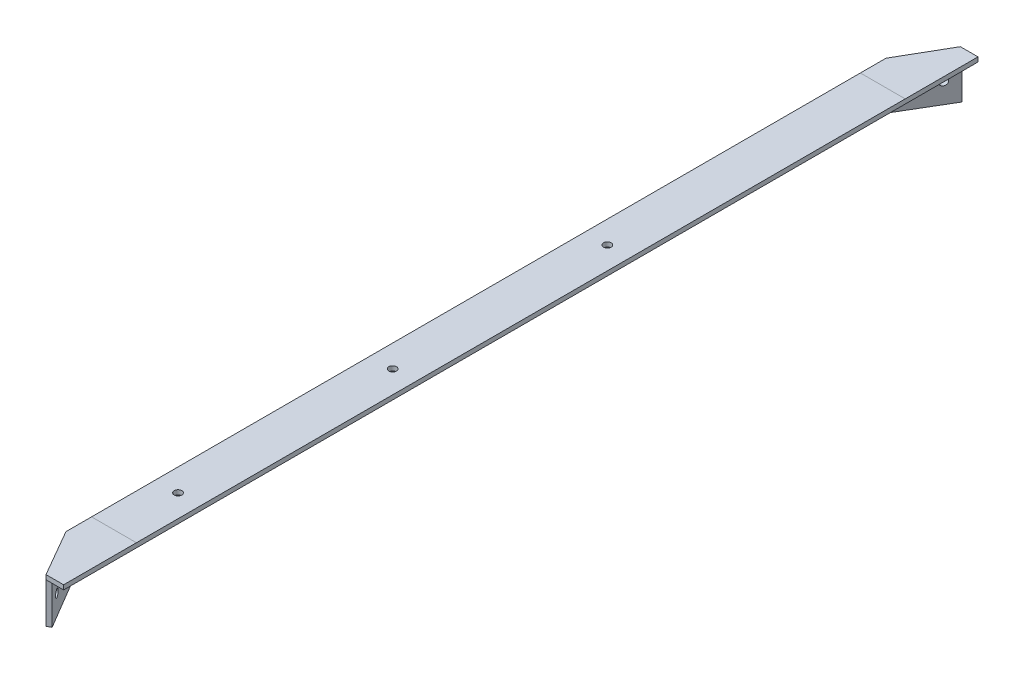
ISO-10303-21;
HEADER;
FILE_DESCRIPTION(('STEP AP214'),'2;1');
FILE_NAME('part.step','',(''),(''),'','','');
FILE_SCHEMA(('AUTOMOTIVE_DESIGN { 1 0 10303 214 1 1 1 1 }'));
ENDSEC;
DATA;
#1=APPLICATION_CONTEXT('core data for automotive mechanical design processes');
#2=APPLICATION_PROTOCOL_DEFINITION('international standard','automotive_design',2000,#1);
#3=PRODUCT_CONTEXT('',#1,'mechanical');
#4=PRODUCT('Part','Part','',(#3));
#5=PRODUCT_RELATED_PRODUCT_CATEGORY('part','',(#4));
#6=PRODUCT_DEFINITION_FORMATION('','',#4);
#7=PRODUCT_DEFINITION_CONTEXT('part definition',#1,'design');
#8=PRODUCT_DEFINITION('design','',#6,#7);
#9=PRODUCT_DEFINITION_SHAPE('','',#8);
#10=(LENGTH_UNIT() NAMED_UNIT(*) SI_UNIT(.MILLI.,.METRE.));
#11=(NAMED_UNIT(*) PLANE_ANGLE_UNIT() SI_UNIT($,.RADIAN.));
#12=(NAMED_UNIT(*) SI_UNIT($,.STERADIAN.) SOLID_ANGLE_UNIT());
#13=UNCERTAINTY_MEASURE_WITH_UNIT(LENGTH_MEASURE(1.E-05),#10,'distance_accuracy_value','');
#14=(GEOMETRIC_REPRESENTATION_CONTEXT(3) GLOBAL_UNCERTAINTY_ASSIGNED_CONTEXT((#13)) GLOBAL_UNIT_ASSIGNED_CONTEXT((#10,
#11,#12)) REPRESENTATION_CONTEXT('',''));
#15=CARTESIAN_POINT('',(0.,0.,0.));
#16=DIRECTION('',(0.,0.,1.));
#17=DIRECTION('',(1.,0.,0.));
#18=AXIS2_PLACEMENT_3D('',#15,#16,#17);
#19=CARTESIAN_POINT('',(0.,70.,640.));
#20=DIRECTION('',(0.,-1.,0.));
#21=DIRECTION('',(0.,0.,-1.));
#22=AXIS2_PLACEMENT_3D('',#19,#20,#21);
#23=PLANE('',#22);
#24=DIRECTION('',(1.,0.,0.));
#25=VECTOR('',#24,1.);
#26=CARTESIAN_POINT('',(0.,70.,600.002159321677));
#27=LINE('',#26,#25);
#28=CARTESIAN_POINT('',(0.,70.,600.002159321677));
#29=VERTEX_POINT('',#28);
#30=CARTESIAN_POINT('',(70.,70.,600.002159321677));
#31=VERTEX_POINT('',#30);
#32=EDGE_CURVE('E11',#29,#31,#27,.T.);
#33=ORIENTED_EDGE('',*,*,#32,.F.);
#34=DIRECTION('',(0.,0.,-1.));
#35=VECTOR('',#34,1.);
#36=CARTESIAN_POINT('',(0.,70.,640.));
#37=LINE('',#36,#35);
#38=CARTESIAN_POINT('',(0.,70.,640.));
#39=VERTEX_POINT('',#38);
#40=EDGE_CURVE('E282',#39,#29,#37,.T.);
#41=ORIENTED_EDGE('',*,*,#40,.F.);
#42=DIRECTION('',(0.5,0.,0.866025403784439));
#43=VECTOR('',#42,1.);
#44=CARTESIAN_POINT('',(0.,70.,640.));
#45=LINE('',#44,#43);
#46=CARTESIAN_POINT('',(42.5,70.,713.612159321677));
#47=VERTEX_POINT('',#46);
#48=EDGE_CURVE('E227',#39,#47,#45,.T.);
#49=ORIENTED_EDGE('',*,*,#48,.T.);
#50=DIRECTION('',(1.,0.,0.));
#51=VECTOR('',#50,1.);
#52=CARTESIAN_POINT('',(42.5,70.,713.612159321677));
#53=LINE('',#52,#51);
#54=CARTESIAN_POINT('',(70.,70.,713.612159321677));
#55=VERTEX_POINT('',#54);
#56=EDGE_CURVE('E230',#47,#55,#53,.T.);
#57=ORIENTED_EDGE('',*,*,#56,.T.);
#58=DIRECTION('',(0.,0.,-1.));
#59=VECTOR('',#58,1.);
#60=CARTESIAN_POINT('',(70.,70.,640.));
#61=LINE('',#60,#59);
#62=EDGE_CURVE('E287',#55,#31,#61,.T.);
#63=ORIENTED_EDGE('',*,*,#62,.T.);
#64=EDGE_LOOP('',(#33,#41,#49,#57,#63));
#65=FACE_BOUND('',#64,.T.);
#66=ADVANCED_FACE('F48',(#65),#23,.F.);
#67=DIRECTION('',(-1.,0.,0.));
#68=VECTOR('',#67,1.);
#69=CARTESIAN_POINT('',(0.,70.,-600.002159321677));
#70=LINE('',#69,#68);
#71=CARTESIAN_POINT('',(70.,70.,-600.002159321677));
#72=VERTEX_POINT('',#71);
#73=CARTESIAN_POINT('',(0.,70.,-600.002159321677));
#74=VERTEX_POINT('',#73);
#75=EDGE_CURVE('E57',#72,#74,#70,.T.);
#76=ORIENTED_EDGE('',*,*,#75,.F.);
#77=CARTESIAN_POINT('',(70.,70.,-713.612159321677));
#78=VERTEX_POINT('',#77);
#79=EDGE_CURVE('E169',#72,#78,#61,.T.);
#80=ORIENTED_EDGE('',*,*,#79,.T.);
#81=DIRECTION('',(1.,0.,0.));
#82=VECTOR('',#81,1.);
#83=CARTESIAN_POINT('',(42.5,70.,-713.612159321677));
#84=LINE('',#83,#82);
#85=CARTESIAN_POINT('',(42.5,70.,-713.612159321677));
#86=VERTEX_POINT('',#85);
#87=EDGE_CURVE('E147',#86,#78,#84,.T.);
#88=ORIENTED_EDGE('',*,*,#87,.F.);
#89=DIRECTION('',(0.5,0.,-0.866025403784439));
#90=VECTOR('',#89,1.);
#91=CARTESIAN_POINT('',(0.,70.,-640.));
#92=LINE('',#91,#90);
#93=CARTESIAN_POINT('',(0.,70.,-640.));
#94=VERTEX_POINT('',#93);
#95=EDGE_CURVE('E159',#94,#86,#92,.T.);
#96=ORIENTED_EDGE('',*,*,#95,.F.);
#97=EDGE_CURVE('E281',#74,#94,#37,.T.);
#98=ORIENTED_EDGE('',*,*,#97,.F.);
#99=EDGE_LOOP('',(#76,#80,#88,#96,#98));
#100=FACE_BOUND('',#99,.T.);
#101=ADVANCED_FACE('F167',(#100),#23,.F.);
#102=CARTESIAN_POINT('',(7.,0.,640.));
#103=DIRECTION('',(0.,1.,0.));
#104=DIRECTION('',(-1.,0.,0.));
#105=AXIS2_PLACEMENT_3D('',#102,#103,#104);
#106=PLANE('',#105);
#107=DIRECTION('',(0.,0.,-1.));
#108=VECTOR('',#107,1.);
#109=CARTESIAN_POINT('',(0.,0.,640.));
#110=LINE('',#109,#108);
#111=CARTESIAN_POINT('',(0.,0.,640.));
#112=VERTEX_POINT('',#111);
#113=CARTESIAN_POINT('',(0.,0.,-640.));
#114=VERTEX_POINT('',#113);
#115=EDGE_CURVE('E278',#112,#114,#110,.T.);
#116=ORIENTED_EDGE('',*,*,#115,.T.);
#117=DIRECTION('',(0.5,0.,-0.866025403784439));
#118=VECTOR('',#117,1.);
#119=CARTESIAN_POINT('',(0.,0.,-640.));
#120=LINE('',#119,#118);
#121=CARTESIAN_POINT('',(42.5,0.,-713.612159321677));
#122=VERTEX_POINT('',#121);
#123=EDGE_CURVE('E154',#114,#122,#120,.T.);
#124=ORIENTED_EDGE('',*,*,#123,.T.);
#125=DIRECTION('',(0.866025403784443,0.,0.499999999999992));
#126=VECTOR('',#125,1.);
#127=CARTESIAN_POINT('',(42.5,0.,-713.612159321677));
#128=LINE('',#127,#126);
#129=CARTESIAN_POINT('',(48.5621778264911,0.,-710.112159321677));
#130=VERTEX_POINT('',#129);
#131=EDGE_CURVE('E192',#122,#130,#128,.T.);
#132=ORIENTED_EDGE('',*,*,#131,.T.);
#133=DIRECTION('',(-0.509931612811304,0.,0.860214944217817));
#134=VECTOR('',#133,1.);
#135=CARTESIAN_POINT('',(48.5621778264911,0.,-710.112159321677));
#136=LINE('',#135,#134);
#137=CARTESIAN_POINT('',(7.,0.,-640.));
#138=VERTEX_POINT('',#137);
#139=EDGE_CURVE('E184',#130,#138,#136,.T.);
#140=ORIENTED_EDGE('',*,*,#139,.T.);
#141=DIRECTION('',(0.,0.,-1.));
#142=VECTOR('',#141,1.);
#143=CARTESIAN_POINT('',(7.,0.,640.));
#144=LINE('',#143,#142);
#145=CARTESIAN_POINT('',(7.,0.,640.));
#146=VERTEX_POINT('',#145);
#147=EDGE_CURVE('E297',#146,#138,#144,.T.);
#148=ORIENTED_EDGE('',*,*,#147,.F.);
#149=DIRECTION('',(-0.509931612811304,0.,-0.860214944217817));
#150=VECTOR('',#149,1.);
#151=CARTESIAN_POINT('',(48.5621778264911,0.,710.112159321677));
#152=LINE('',#151,#150);
#153=CARTESIAN_POINT('',(48.5621778264911,0.,710.112159321677));
#154=VERTEX_POINT('',#153);
#155=EDGE_CURVE('E251',#154,#146,#152,.T.);
#156=ORIENTED_EDGE('',*,*,#155,.F.);
#157=DIRECTION('',(0.866025403784443,0.,-0.499999999999992));
#158=VECTOR('',#157,1.);
#159=CARTESIAN_POINT('',(42.5,0.,713.612159321677));
#160=LINE('',#159,#158);
#161=CARTESIAN_POINT('',(42.5,0.,713.612159321677));
#162=VERTEX_POINT('',#161);
#163=EDGE_CURVE('E258',#162,#154,#160,.T.);
#164=ORIENTED_EDGE('',*,*,#163,.F.);
#165=DIRECTION('',(0.5,0.,0.866025403784439));
#166=VECTOR('',#165,1.);
#167=CARTESIAN_POINT('',(0.,0.,640.));
#168=LINE('',#167,#166);
#169=EDGE_CURVE('E245',#112,#162,#168,.T.);
#170=ORIENTED_EDGE('',*,*,#169,.F.);
#171=EDGE_LOOP('',(#116,#124,#132,#140,#148,#156,#164,#170));
#172=FACE_BOUND('',#171,.T.);
#173=ADVANCED_FACE('F50',(#172),#106,.F.);
#174=CARTESIAN_POINT('',(6.99999999999999,63.,640.));
#175=DIRECTION('',(-1.,0.,0.));
#176=DIRECTION('',(0.,-1.,0.));
#177=AXIS2_PLACEMENT_3D('',#174,#175,#176);
#178=PLANE('',#177);
#179=ORIENTED_EDGE('',*,*,#147,.T.);
#180=DIRECTION('',(0.,1.,0.));
#181=VECTOR('',#180,1.);
#182=CARTESIAN_POINT('',(6.99999999999999,63.,-640.));
#183=LINE('',#182,#181);
#184=CARTESIAN_POINT('',(6.99999999999999,63.,-640.));
#185=VERTEX_POINT('',#184);
#186=EDGE_CURVE('E204',#138,#185,#183,.T.);
#187=ORIENTED_EDGE('',*,*,#186,.T.);
#188=DIRECTION('',(0.,0.,-1.));
#189=VECTOR('',#188,1.);
#190=CARTESIAN_POINT('',(6.99999999999999,63.,640.));
#191=LINE('',#190,#189);
#192=CARTESIAN_POINT('',(6.99999999999999,63.,640.));
#193=VERTEX_POINT('',#192);
#194=EDGE_CURVE('E294',#193,#185,#191,.T.);
#195=ORIENTED_EDGE('',*,*,#194,.F.);
#196=DIRECTION('',(0.,1.,0.));
#197=VECTOR('',#196,1.);
#198=CARTESIAN_POINT('',(6.99999999999999,63.,640.));
#199=LINE('',#198,#197);
#200=EDGE_CURVE('E271',#146,#193,#199,.T.);
#201=ORIENTED_EDGE('',*,*,#200,.F.);
#202=EDGE_LOOP('',(#179,#187,#195,#201));
#203=FACE_BOUND('',#202,.T.);
#204=ADVANCED_FACE('F360',(#203),#178,.F.);
#205=CARTESIAN_POINT('',(70.,63.,640.));
#206=DIRECTION('',(0.,1.,0.));
#207=DIRECTION('',(-1.,0.,0.));
#208=AXIS2_PLACEMENT_3D('',#205,#206,#207);
#209=PLANE('',#208);
#210=CARTESIAN_POINT('',(35.,63.,500.));
#211=DIRECTION('',(0.,1.,0.));
#212=DIRECTION('',(-1.,0.,0.));
#213=AXIS2_PLACEMENT_3D('',#210,#211,#212);
#214=CIRCLE('',#213,6.);
#215=CARTESIAN_POINT('',(29.,63.,500.));
#216=VERTEX_POINT('',#215);
#217=EDGE_CURVE('E313',#216,#216,#214,.F.);
#218=ORIENTED_EDGE('',*,*,#217,.F.);
#219=EDGE_LOOP('',(#218));
#220=FACE_BOUND('',#219,.T.);
#221=CARTESIAN_POINT('',(35.,63.,165.));
#222=DIRECTION('',(0.,1.,0.));
#223=DIRECTION('',(-1.,0.,0.));
#224=AXIS2_PLACEMENT_3D('',#221,#222,#223);
#225=CIRCLE('',#224,6.);
#226=CARTESIAN_POINT('',(29.,63.,165.));
#227=VERTEX_POINT('',#226);
#228=EDGE_CURVE('E309',#227,#227,#225,.F.);
#229=ORIENTED_EDGE('',*,*,#228,.F.);
#230=EDGE_LOOP('',(#229));
#231=FACE_BOUND('',#230,.T.);
#232=CARTESIAN_POINT('',(35.,63.,-170.));
#233=DIRECTION('',(0.,1.,0.));
#234=DIRECTION('',(-1.,0.,0.));
#235=AXIS2_PLACEMENT_3D('',#232,#233,#234);
#236=CIRCLE('',#235,6.);
#237=CARTESIAN_POINT('',(29.,63.,-170.));
#238=VERTEX_POINT('',#237);
#239=EDGE_CURVE('E304',#238,#238,#236,.F.);
#240=ORIENTED_EDGE('',*,*,#239,.F.);
#241=EDGE_LOOP('',(#240));
#242=FACE_BOUND('',#241,.T.);
#243=ORIENTED_EDGE('',*,*,#194,.T.);
#244=DIRECTION('',(-0.509931612811304,0.,0.860214944217817));
#245=VECTOR('',#244,1.);
#246=CARTESIAN_POINT('',(48.5621778264911,63.,-710.112159321677));
#247=LINE('',#246,#245);
#248=CARTESIAN_POINT('',(48.5621778264911,63.,-710.112159321677));
#249=VERTEX_POINT('',#248);
#250=EDGE_CURVE('E183',#249,#185,#247,.T.);
#251=ORIENTED_EDGE('',*,*,#250,.F.);
#252=DIRECTION('',(0.866025403784443,0.,0.499999999999992));
#253=VECTOR('',#252,1.);
#254=CARTESIAN_POINT('',(42.5,63.,-713.612159321677));
#255=LINE('',#254,#253);
#256=CARTESIAN_POINT('',(42.5,63.,-713.612159321677));
#257=VERTEX_POINT('',#256);
#258=EDGE_CURVE('E179',#257,#249,#255,.T.);
#259=ORIENTED_EDGE('',*,*,#258,.F.);
#260=DIRECTION('',(1.,0.,0.));
#261=VECTOR('',#260,1.);
#262=CARTESIAN_POINT('',(42.5,63.,-713.612159321677));
#263=LINE('',#262,#261);
#264=CARTESIAN_POINT('',(70.,63.,-713.612159321677));
#265=VERTEX_POINT('',#264);
#266=EDGE_CURVE('E150',#257,#265,#263,.T.);
#267=ORIENTED_EDGE('',*,*,#266,.T.);
#268=DIRECTION('',(0.,0.,-1.));
#269=VECTOR('',#268,1.);
#270=CARTESIAN_POINT('',(70.,63.,640.));
#271=LINE('',#270,#269);
#272=CARTESIAN_POINT('',(70.,63.,713.612159321677));
#273=VERTEX_POINT('',#272);
#274=EDGE_CURVE('E290',#273,#265,#271,.T.);
#275=ORIENTED_EDGE('',*,*,#274,.F.);
#276=DIRECTION('',(1.,0.,0.));
#277=VECTOR('',#276,1.);
#278=CARTESIAN_POINT('',(42.5,63.,713.612159321677));
#279=LINE('',#278,#277);
#280=CARTESIAN_POINT('',(42.5,63.,713.612159321677));
#281=VERTEX_POINT('',#280);
#282=EDGE_CURVE('E226',#281,#273,#279,.T.);
#283=ORIENTED_EDGE('',*,*,#282,.F.);
#284=DIRECTION('',(0.866025403784443,0.,-0.499999999999992));
#285=VECTOR('',#284,1.);
#286=CARTESIAN_POINT('',(42.5,63.,713.612159321677));
#287=LINE('',#286,#285);
#288=CARTESIAN_POINT('',(48.5621778264911,63.,710.112159321677));
#289=VERTEX_POINT('',#288);
#290=EDGE_CURVE('E246',#281,#289,#287,.T.);
#291=ORIENTED_EDGE('',*,*,#290,.T.);
#292=DIRECTION('',(-0.509931612811304,0.,-0.860214944217817));
#293=VECTOR('',#292,1.);
#294=CARTESIAN_POINT('',(48.5621778264911,63.,710.112159321677));
#295=LINE('',#294,#293);
#296=EDGE_CURVE('E250',#289,#193,#295,.T.);
#297=ORIENTED_EDGE('',*,*,#296,.T.);
#298=EDGE_LOOP('',(#243,#251,#259,#267,#275,#283,#291,#297));
#299=FACE_BOUND('',#298,.T.);
#300=ADVANCED_FACE('F343',(#220,#231,#242,#299),#209,.F.);
#301=CARTESIAN_POINT('',(70.,70.,640.));
#302=DIRECTION('',(-1.,0.,0.));
#303=DIRECTION('',(0.,0.,1.));
#304=AXIS2_PLACEMENT_3D('',#301,#302,#303);
#305=PLANE('',#304);
#306=ORIENTED_EDGE('',*,*,#274,.T.);
#307=DIRECTION('',(0.,-1.,0.));
#308=VECTOR('',#307,1.);
#309=CARTESIAN_POINT('',(70.,70.,-713.612159321677));
#310=LINE('',#309,#308);
#311=EDGE_CURVE('E155',#78,#265,#310,.T.);
#312=ORIENTED_EDGE('',*,*,#311,.F.);
#313=ORIENTED_EDGE('',*,*,#79,.F.);
#314=EDGE_CURVE('E291',#31,#72,#61,.T.);
#315=ORIENTED_EDGE('',*,*,#314,.F.);
#316=ORIENTED_EDGE('',*,*,#62,.F.);
#317=DIRECTION('',(0.,-1.,0.));
#318=VECTOR('',#317,1.);
#319=CARTESIAN_POINT('',(70.,70.,713.612159321677));
#320=LINE('',#319,#318);
#321=EDGE_CURVE('E234',#55,#273,#320,.T.);
#322=ORIENTED_EDGE('',*,*,#321,.T.);
#323=EDGE_LOOP('',(#306,#312,#313,#315,#316,#322));
#324=FACE_BOUND('',#323,.T.);
#325=ADVANCED_FACE('F329',(#324),#305,.F.);
#326=CARTESIAN_POINT('',(35.,70.,500.));
#327=DIRECTION('',(0.,-1.,0.));
#328=DIRECTION('',(0.,0.,-1.));
#329=AXIS2_PLACEMENT_3D('',#326,#327,#328);
#330=CIRCLE('',#329,6.);
#331=CARTESIAN_POINT('',(35.,70.,494.));
#332=VERTEX_POINT('',#331);
#333=EDGE_CURVE('E310',#332,#332,#330,.F.);
#334=ORIENTED_EDGE('',*,*,#333,.F.);
#335=EDGE_LOOP('',(#334));
#336=FACE_BOUND('',#335,.T.);
#337=CARTESIAN_POINT('',(35.,70.,165.));
#338=DIRECTION('',(0.,-1.,0.));
#339=DIRECTION('',(0.,0.,-1.));
#340=AXIS2_PLACEMENT_3D('',#337,#338,#339);
#341=CIRCLE('',#340,6.);
#342=CARTESIAN_POINT('',(35.,70.,159.));
#343=VERTEX_POINT('',#342);
#344=EDGE_CURVE('E305',#343,#343,#341,.F.);
#345=ORIENTED_EDGE('',*,*,#344,.F.);
#346=EDGE_LOOP('',(#345));
#347=FACE_BOUND('',#346,.T.);
#348=CARTESIAN_POINT('',(35.,70.,-170.));
#349=DIRECTION('',(0.,-1.,0.));
#350=DIRECTION('',(0.,0.,-1.));
#351=AXIS2_PLACEMENT_3D('',#348,#349,#350);
#352=CIRCLE('',#351,6.);
#353=CARTESIAN_POINT('',(35.,70.,-176.));
#354=VERTEX_POINT('',#353);
#355=EDGE_CURVE('E300',#354,#354,#352,.F.);
#356=ORIENTED_EDGE('',*,*,#355,.F.);
#357=EDGE_LOOP('',(#356));
#358=FACE_BOUND('',#357,.T.);
#359=EDGE_CURVE('E286',#29,#74,#37,.T.);
#360=ORIENTED_EDGE('',*,*,#359,.F.);
#361=ORIENTED_EDGE('',*,*,#32,.T.);
#362=ORIENTED_EDGE('',*,*,#314,.T.);
#363=ORIENTED_EDGE('',*,*,#75,.T.);
#364=EDGE_LOOP('',(#360,#361,#362,#363));
#365=FACE_BOUND('',#364,.T.);
#366=ADVANCED_FACE('F330',(#336,#347,#358,#365),#23,.F.);
#367=CARTESIAN_POINT('',(0.,0.,640.));
#368=DIRECTION('',(1.,0.,0.));
#369=DIRECTION('',(0.,0.,-1.));
#370=AXIS2_PLACEMENT_3D('',#367,#368,#369);
#371=PLANE('',#370);
#372=ORIENTED_EDGE('',*,*,#40,.T.);
#373=ORIENTED_EDGE('',*,*,#359,.T.);
#374=ORIENTED_EDGE('',*,*,#97,.T.);
#375=DIRECTION('',(0.,-1.,0.));
#376=VECTOR('',#375,1.);
#377=CARTESIAN_POINT('',(0.,0.,-640.));
#378=LINE('',#377,#376);
#379=EDGE_CURVE('E163',#94,#114,#378,.T.);
#380=ORIENTED_EDGE('',*,*,#379,.T.);
#381=ORIENTED_EDGE('',*,*,#115,.F.);
#382=DIRECTION('',(0.,-1.,0.));
#383=VECTOR('',#382,1.);
#384=CARTESIAN_POINT('',(0.,0.,640.));
#385=LINE('',#384,#383);
#386=EDGE_CURVE('E275',#39,#112,#385,.T.);
#387=ORIENTED_EDGE('',*,*,#386,.F.);
#388=EDGE_LOOP('',(#372,#373,#374,#380,#381,#387));
#389=FACE_BOUND('',#388,.T.);
#390=ADVANCED_FACE('F325',(#389),#371,.F.);
#391=CARTESIAN_POINT('',(0.,63.,640.));
#392=DIRECTION('',(0.866025403784439,0.,-0.5));
#393=DIRECTION('',(-0.5,0.,-0.866025403784439));
#394=AXIS2_PLACEMENT_3D('',#391,#392,#393);
#395=PLANE('',#394);
#396=CARTESIAN_POINT('',(31.9145711589445,31.5,695.277658749064));
#397=DIRECTION('',(0.866025403784439,0.,-0.5));
#398=DIRECTION('',(-0.5,0.,-0.866025403784439));
#399=AXIS2_PLACEMENT_3D('',#396,#397,#398);
#400=ELLIPSE('',#399,6.00039722141594,5.99999999999998);
#401=CARTESIAN_POINT('',(28.9143725482365,31.5,690.081162322521));
#402=VERTEX_POINT('',#401);
#403=EDGE_CURVE('E222',#402,#402,#400,.T.);
#404=ORIENTED_EDGE('',*,*,#403,.T.);
#405=EDGE_LOOP('',(#404));
#406=FACE_BOUND('',#405,.T.);
#407=CARTESIAN_POINT('',(12.4105822152888,31.5,661.495758948391));
#408=DIRECTION('',(0.866025403784439,0.,-0.5));
#409=DIRECTION('',(-0.5,0.,-0.866025403784439));
#410=AXIS2_PLACEMENT_3D('',#407,#408,#409);
#411=ELLIPSE('',#410,6.00039722141603,6.00000000000007);
#412=CARTESIAN_POINT('',(9.41038360458082,31.5,656.299262521847));
#413=VERTEX_POINT('',#412);
#414=EDGE_CURVE('E215',#413,#413,#411,.T.);
#415=ORIENTED_EDGE('',*,*,#414,.T.);
#416=EDGE_LOOP('',(#415));
#417=FACE_BOUND('',#416,.T.);
#418=ORIENTED_EDGE('',*,*,#169,.T.);
#419=DIRECTION('',(0.,-1.,0.));
#420=VECTOR('',#419,1.);
#421=CARTESIAN_POINT('',(42.5,63.,713.612159321677));
#422=LINE('',#421,#420);
#423=EDGE_CURVE('E267',#281,#162,#422,.T.);
#424=ORIENTED_EDGE('',*,*,#423,.F.);
#425=DIRECTION('',(0.,-1.,0.));
#426=VECTOR('',#425,1.);
#427=CARTESIAN_POINT('',(42.5,70.,713.612159321677));
#428=LINE('',#427,#426);
#429=EDGE_CURVE('E241',#47,#281,#428,.T.);
#430=ORIENTED_EDGE('',*,*,#429,.F.);
#431=ORIENTED_EDGE('',*,*,#48,.F.);
#432=ORIENTED_EDGE('',*,*,#386,.T.);
#433=EDGE_LOOP('',(#418,#424,#430,#431,#432));
#434=FACE_BOUND('',#433,.T.);
#435=ADVANCED_FACE('F338',(#406,#417,#434),#395,.F.);
#436=CARTESIAN_POINT('',(42.5,63.,713.612159321677));
#437=DIRECTION('',(-0.499999999999992,0.,-0.866025403784443));
#438=DIRECTION('',(-0.866025403784443,0.,0.499999999999992));
#439=AXIS2_PLACEMENT_3D('',#436,#437,#438);
#440=PLANE('',#439);
#441=ORIENTED_EDGE('',*,*,#163,.T.);
#442=DIRECTION('',(0.,-1.,0.));
#443=VECTOR('',#442,1.);
#444=CARTESIAN_POINT('',(48.5621778264911,63.,710.112159321677));
#445=LINE('',#444,#443);
#446=EDGE_CURVE('E255',#289,#154,#445,.T.);
#447=ORIENTED_EDGE('',*,*,#446,.F.);
#448=ORIENTED_EDGE('',*,*,#290,.F.);
#449=ORIENTED_EDGE('',*,*,#423,.T.);
#450=EDGE_LOOP('',(#441,#447,#448,#449));
#451=FACE_BOUND('',#450,.T.);
#452=ADVANCED_FACE('F354',(#451),#440,.F.);
#453=CARTESIAN_POINT('',(48.5621778264911,63.,710.112159321677));
#454=DIRECTION('',(-0.860214944217817,0.,0.509931612811304));
#455=DIRECTION('',(0.509931612811304,0.,0.860214944217817));
#456=AXIS2_PLACEMENT_3D('',#453,#454,#455);
#457=PLANE('',#456);
#458=CARTESIAN_POINT('',(37.7261310542509,31.5,691.832591757049));
#459=DIRECTION('',(0.860214944217817,0.,-0.509931612811304));
#460=DIRECTION('',(-0.509931612811304,0.,-0.860214944217817));
#461=AXIS2_PLACEMENT_3D('',#458,#459,#460);
#462=CIRCLE('',#461,5.99999999999998);
#463=CARTESIAN_POINT('',(34.6665413773831,31.5,686.671302091742));
#464=VERTEX_POINT('',#463);
#465=EDGE_CURVE('E211',#464,#464,#462,.T.);
#466=ORIENTED_EDGE('',*,*,#465,.F.);
#467=EDGE_LOOP('',(#466));
#468=FACE_BOUND('',#467,.T.);
#469=CARTESIAN_POINT('',(17.8360467722402,31.5,658.279567564629));
#470=DIRECTION('',(0.860214944217817,0.,-0.509931612811304));
#471=DIRECTION('',(-0.509931612811304,0.,-0.860214944217817));
#472=AXIS2_PLACEMENT_3D('',#469,#470,#471);
#473=CIRCLE('',#472,6.00000000000007);
#474=CARTESIAN_POINT('',(14.7764570953724,31.5,653.118277899322));
#475=VERTEX_POINT('',#474);
#476=EDGE_CURVE('E210',#475,#475,#473,.T.);
#477=ORIENTED_EDGE('',*,*,#476,.F.);
#478=EDGE_LOOP('',(#477));
#479=FACE_BOUND('',#478,.T.);
#480=ORIENTED_EDGE('',*,*,#155,.T.);
#481=ORIENTED_EDGE('',*,*,#200,.T.);
#482=ORIENTED_EDGE('',*,*,#296,.F.);
#483=ORIENTED_EDGE('',*,*,#446,.T.);
#484=EDGE_LOOP('',(#480,#481,#482,#483));
#485=FACE_BOUND('',#484,.T.);
#486=ADVANCED_FACE('F357',(#468,#479,#485),#457,.F.);
#487=CARTESIAN_POINT('',(42.5,70.,713.612159321677));
#488=DIRECTION('',(0.,0.,-1.));
#489=DIRECTION('',(-1.,0.,0.));
#490=AXIS2_PLACEMENT_3D('',#487,#488,#489);
#491=PLANE('',#490);
#492=ORIENTED_EDGE('',*,*,#282,.T.);
#493=ORIENTED_EDGE('',*,*,#321,.F.);
#494=ORIENTED_EDGE('',*,*,#56,.F.);
#495=ORIENTED_EDGE('',*,*,#429,.T.);
#496=EDGE_LOOP('',(#492,#493,#494,#495));
#497=FACE_BOUND('',#496,.T.);
#498=ADVANCED_FACE('F341',(#497),#491,.F.);
#499=CARTESIAN_POINT('',(9.23389733006204,31.5,663.378883692742));
#500=DIRECTION('',(0.860214944217817,0.,-0.509931612811304));
#501=DIRECTION('',(-0.509931612811304,0.,-0.860214944217817));
#502=AXIS2_PLACEMENT_3D('',#499,#500,#501);
#503=CYLINDRICAL_SURFACE('',#502,6.00000000000007);
#504=ORIENTED_EDGE('',*,*,#476,.T.);
#505=EDGE_LOOP('',(#504));
#506=FACE_BOUND('',#505,.T.);
#507=ORIENTED_EDGE('',*,*,#414,.F.);
#508=EDGE_LOOP('',(#507));
#509=FACE_BOUND('',#508,.T.);
#510=ADVANCED_FACE('F476',(#506,#509),#503,.F.);
#511=CARTESIAN_POINT('',(29.1239816120727,31.5,696.931907885162));
#512=DIRECTION('',(0.860214944217817,0.,-0.509931612811304));
#513=DIRECTION('',(-0.509931612811304,0.,-0.860214944217817));
#514=AXIS2_PLACEMENT_3D('',#511,#512,#513);
#515=CYLINDRICAL_SURFACE('',#514,5.99999999999998);
#516=ORIENTED_EDGE('',*,*,#465,.T.);
#517=EDGE_LOOP('',(#516));
#518=FACE_BOUND('',#517,.T.);
#519=ORIENTED_EDGE('',*,*,#403,.F.);
#520=EDGE_LOOP('',(#519));
#521=FACE_BOUND('',#520,.T.);
#522=ADVANCED_FACE('F431',(#518,#521),#515,.F.);
#523=CARTESIAN_POINT('',(0.,63.,-640.));
#524=DIRECTION('',(0.866025403784439,0.,0.5));
#525=DIRECTION('',(-0.5,0.,0.866025403784439));
#526=AXIS2_PLACEMENT_3D('',#523,#524,#525);
#527=PLANE('',#526);
#528=CARTESIAN_POINT('',(31.9145711589445,31.5,-695.277658749064));
#529=DIRECTION('',(-0.866025403784439,0.,-0.5));
#530=DIRECTION('',(-0.5,0.,0.866025403784439));
#531=AXIS2_PLACEMENT_3D('',#528,#529,#530);
#532=ELLIPSE('',#531,6.00039722141594,5.99999999999998);
#533=CARTESIAN_POINT('',(28.9143725482365,31.5,-690.081162322521));
#534=VERTEX_POINT('',#533);
#535=EDGE_CURVE('E177',#534,#534,#532,.T.);
#536=ORIENTED_EDGE('',*,*,#535,.F.);
#537=EDGE_LOOP('',(#536));
#538=FACE_BOUND('',#537,.T.);
#539=CARTESIAN_POINT('',(12.4105822152888,31.5,-661.495758948391));
#540=DIRECTION('',(-0.866025403784439,0.,-0.5));
#541=DIRECTION('',(-0.5,0.,0.866025403784439));
#542=AXIS2_PLACEMENT_3D('',#539,#540,#541);
#543=ELLIPSE('',#542,6.00039722141603,6.00000000000007);
#544=CARTESIAN_POINT('',(9.41038360458082,31.5,-656.299262521847));
#545=VERTEX_POINT('',#544);
#546=EDGE_CURVE('E418',#545,#545,#543,.T.);
#547=ORIENTED_EDGE('',*,*,#546,.F.);
#548=EDGE_LOOP('',(#547));
#549=FACE_BOUND('',#548,.T.);
#550=ORIENTED_EDGE('',*,*,#123,.F.);
#551=ORIENTED_EDGE('',*,*,#379,.F.);
#552=ORIENTED_EDGE('',*,*,#95,.T.);
#553=DIRECTION('',(0.,-1.,0.));
#554=VECTOR('',#553,1.);
#555=CARTESIAN_POINT('',(42.5,70.,-713.612159321677));
#556=LINE('',#555,#554);
#557=EDGE_CURVE('E142',#86,#257,#556,.T.);
#558=ORIENTED_EDGE('',*,*,#557,.T.);
#559=DIRECTION('',(0.,-1.,0.));
#560=VECTOR('',#559,1.);
#561=CARTESIAN_POINT('',(42.5,63.,-713.612159321677));
#562=LINE('',#561,#560);
#563=EDGE_CURVE('E201',#257,#122,#562,.T.);
#564=ORIENTED_EDGE('',*,*,#563,.T.);
#565=EDGE_LOOP('',(#550,#551,#552,#558,#564));
#566=FACE_BOUND('',#565,.T.);
#567=ADVANCED_FACE('F161',(#538,#549,#566),#527,.F.);
#568=CARTESIAN_POINT('',(42.5,63.,-713.612159321677));
#569=DIRECTION('',(-0.499999999999992,0.,0.866025403784443));
#570=DIRECTION('',(-0.866025403784443,0.,-0.499999999999992));
#571=AXIS2_PLACEMENT_3D('',#568,#569,#570);
#572=PLANE('',#571);
#573=ORIENTED_EDGE('',*,*,#131,.F.);
#574=ORIENTED_EDGE('',*,*,#563,.F.);
#575=ORIENTED_EDGE('',*,*,#258,.T.);
#576=DIRECTION('',(0.,-1.,0.));
#577=VECTOR('',#576,1.);
#578=CARTESIAN_POINT('',(48.5621778264911,63.,-710.112159321677));
#579=LINE('',#578,#577);
#580=EDGE_CURVE('E188',#249,#130,#579,.T.);
#581=ORIENTED_EDGE('',*,*,#580,.T.);
#582=EDGE_LOOP('',(#573,#574,#575,#581));
#583=FACE_BOUND('',#582,.T.);
#584=ADVANCED_FACE('F347',(#583),#572,.F.);
#585=CARTESIAN_POINT('',(48.5621778264911,63.,-710.112159321677));
#586=DIRECTION('',(-0.860214944217817,0.,-0.509931612811304));
#587=DIRECTION('',(0.509931612811304,0.,-0.860214944217817));
#588=AXIS2_PLACEMENT_3D('',#585,#586,#587);
#589=PLANE('',#588);
#590=CARTESIAN_POINT('',(37.7261310542509,31.5,-691.832591757049));
#591=DIRECTION('',(-0.860214944217817,0.,-0.509931612811304));
#592=DIRECTION('',(-0.509931612811304,0.,0.860214944217817));
#593=AXIS2_PLACEMENT_3D('',#590,#591,#592);
#594=CIRCLE('',#593,5.99999999999998);
#595=CARTESIAN_POINT('',(34.6665413773831,31.5,-686.671302091742));
#596=VERTEX_POINT('',#595);
#597=EDGE_CURVE('E415',#596,#596,#594,.T.);
#598=ORIENTED_EDGE('',*,*,#597,.T.);
#599=EDGE_LOOP('',(#598));
#600=FACE_BOUND('',#599,.T.);
#601=CARTESIAN_POINT('',(17.8360467722402,31.5,-658.279567564629));
#602=DIRECTION('',(-0.860214944217817,0.,-0.509931612811304));
#603=DIRECTION('',(-0.509931612811304,0.,0.860214944217817));
#604=AXIS2_PLACEMENT_3D('',#601,#602,#603);
#605=CIRCLE('',#604,6.00000000000007);
#606=CARTESIAN_POINT('',(14.7764570953724,31.5,-653.118277899322));
#607=VERTEX_POINT('',#606);
#608=EDGE_CURVE('E414',#607,#607,#605,.T.);
#609=ORIENTED_EDGE('',*,*,#608,.T.);
#610=EDGE_LOOP('',(#609));
#611=FACE_BOUND('',#610,.T.);
#612=ORIENTED_EDGE('',*,*,#139,.F.);
#613=ORIENTED_EDGE('',*,*,#580,.F.);
#614=ORIENTED_EDGE('',*,*,#250,.T.);
#615=ORIENTED_EDGE('',*,*,#186,.F.);
#616=EDGE_LOOP('',(#612,#613,#614,#615));
#617=FACE_BOUND('',#616,.T.);
#618=ADVANCED_FACE('F363',(#600,#611,#617),#589,.F.);
#619=CARTESIAN_POINT('',(42.5,70.,-713.612159321677));
#620=DIRECTION('',(0.,0.,1.));
#621=DIRECTION('',(-1.,0.,0.));
#622=AXIS2_PLACEMENT_3D('',#619,#620,#621);
#623=PLANE('',#622);
#624=ORIENTED_EDGE('',*,*,#266,.F.);
#625=ORIENTED_EDGE('',*,*,#557,.F.);
#626=ORIENTED_EDGE('',*,*,#87,.T.);
#627=ORIENTED_EDGE('',*,*,#311,.T.);
#628=EDGE_LOOP('',(#624,#625,#626,#627));
#629=FACE_BOUND('',#628,.T.);
#630=ADVANCED_FACE('F144',(#629),#623,.F.);
#631=CARTESIAN_POINT('',(9.23389733006204,31.5,-663.378883692742));
#632=DIRECTION('',(0.860214944217817,0.,0.509931612811304));
#633=DIRECTION('',(-0.509931612811304,0.,0.860214944217817));
#634=AXIS2_PLACEMENT_3D('',#631,#632,#633);
#635=CYLINDRICAL_SURFACE('',#634,6.00000000000007);
#636=ORIENTED_EDGE('',*,*,#608,.F.);
#637=EDGE_LOOP('',(#636));
#638=FACE_BOUND('',#637,.T.);
#639=ORIENTED_EDGE('',*,*,#546,.T.);
#640=EDGE_LOOP('',(#639));
#641=FACE_BOUND('',#640,.T.);
#642=ADVANCED_FACE('F371',(#638,#641),#635,.F.);
#643=CARTESIAN_POINT('',(29.1239816120727,31.5,-696.931907885162));
#644=DIRECTION('',(0.860214944217817,0.,0.509931612811304));
#645=DIRECTION('',(-0.509931612811304,0.,0.860214944217817));
#646=AXIS2_PLACEMENT_3D('',#643,#644,#645);
#647=CYLINDRICAL_SURFACE('',#646,5.99999999999998);
#648=ORIENTED_EDGE('',*,*,#597,.F.);
#649=EDGE_LOOP('',(#648));
#650=FACE_BOUND('',#649,.T.);
#651=ORIENTED_EDGE('',*,*,#535,.T.);
#652=EDGE_LOOP('',(#651));
#653=FACE_BOUND('',#652,.T.);
#654=ADVANCED_FACE('F400',(#650,#653),#647,.F.);
#655=CARTESIAN_POINT('',(35.,80.,-170.));
#656=DIRECTION('',(0.,-1.,0.));
#657=DIRECTION('',(0.,0.,-1.));
#658=AXIS2_PLACEMENT_3D('',#655,#656,#657);
#659=CYLINDRICAL_SURFACE('',#658,6.);
#660=ORIENTED_EDGE('',*,*,#355,.T.);
#661=EDGE_LOOP('',(#660));
#662=FACE_BOUND('',#661,.T.);
#663=ORIENTED_EDGE('',*,*,#239,.T.);
#664=EDGE_LOOP('',(#663));
#665=FACE_BOUND('',#664,.T.);
#666=ADVANCED_FACE('F396',(#662,#665),#659,.F.);
#667=CARTESIAN_POINT('',(35.,80.,165.));
#668=DIRECTION('',(0.,-1.,0.));
#669=DIRECTION('',(0.,0.,-1.));
#670=AXIS2_PLACEMENT_3D('',#667,#668,#669);
#671=CYLINDRICAL_SURFACE('',#670,6.);
#672=ORIENTED_EDGE('',*,*,#344,.T.);
#673=EDGE_LOOP('',(#672));
#674=FACE_BOUND('',#673,.T.);
#675=ORIENTED_EDGE('',*,*,#228,.T.);
#676=EDGE_LOOP('',(#675));
#677=FACE_BOUND('',#676,.T.);
#678=ADVANCED_FACE('F399',(#674,#677),#671,.F.);
#679=CARTESIAN_POINT('',(35.,80.,500.));
#680=DIRECTION('',(0.,-1.,0.));
#681=DIRECTION('',(0.,0.,-1.));
#682=AXIS2_PLACEMENT_3D('',#679,#680,#681);
#683=CYLINDRICAL_SURFACE('',#682,6.);
#684=ORIENTED_EDGE('',*,*,#333,.T.);
#685=EDGE_LOOP('',(#684));
#686=FACE_BOUND('',#685,.T.);
#687=ORIENTED_EDGE('',*,*,#217,.T.);
#688=EDGE_LOOP('',(#687));
#689=FACE_BOUND('',#688,.T.);
#690=ADVANCED_FACE('F447',(#686,#689),#683,.F.);
#691=CLOSED_SHELL('',(#66,#101,#173,#204,#300,#325,#366,#390,#435,#452,#486,#498,#510,#522,#567,
#584,#618,#630,#642,#654,#666,#678,#690));
#692=MANIFOLD_SOLID_BREP('B2',#691);
#693=ADVANCED_BREP_SHAPE_REPRESENTATION('',(#18,#692),#14);
#694=SHAPE_DEFINITION_REPRESENTATION(#9,#693);
ENDSEC;
END-ISO-10303-21;
